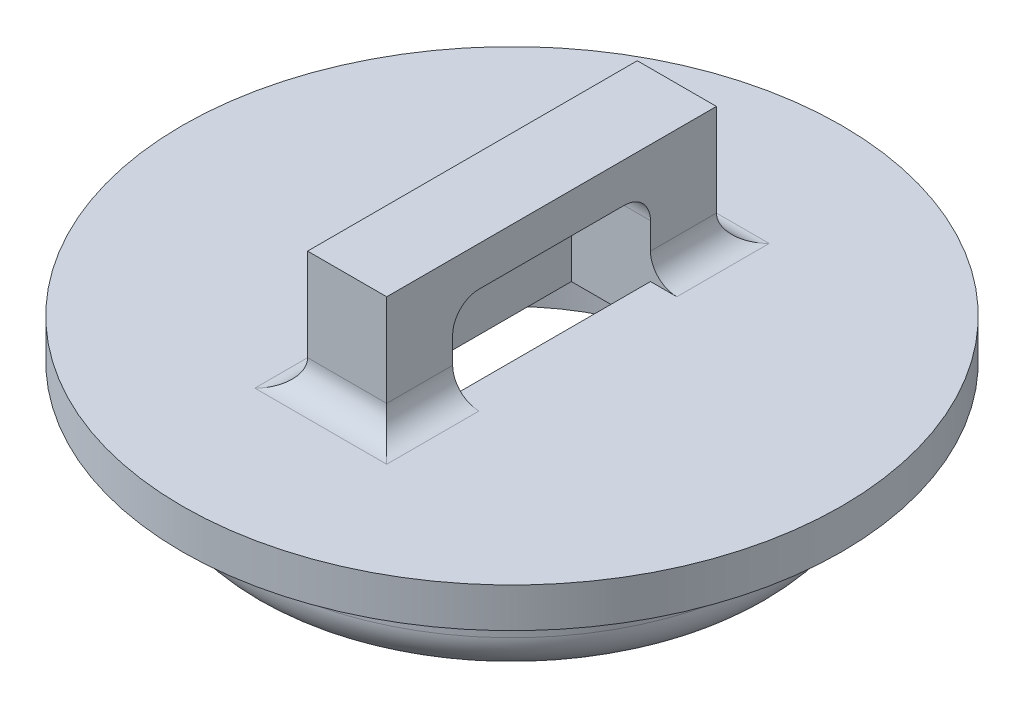
ISO-10303-21;
HEADER;
FILE_DESCRIPTION(('STEP AP214'),'2;1');
FILE_NAME('part.step','',(''),(''),'','','');
FILE_SCHEMA(('AUTOMOTIVE_DESIGN { 1 0 10303 214 1 1 1 1 }'));
ENDSEC;
DATA;
#1=APPLICATION_CONTEXT('core data for automotive mechanical design processes');
#2=APPLICATION_PROTOCOL_DEFINITION('international standard','automotive_design',2000,#1);
#3=PRODUCT_CONTEXT('',#1,'mechanical');
#4=PRODUCT('Part','Part','',(#3));
#5=PRODUCT_RELATED_PRODUCT_CATEGORY('part','',(#4));
#6=PRODUCT_DEFINITION_FORMATION('','',#4);
#7=PRODUCT_DEFINITION_CONTEXT('part definition',#1,'design');
#8=PRODUCT_DEFINITION('design','',#6,#7);
#9=PRODUCT_DEFINITION_SHAPE('','',#8);
#10=(LENGTH_UNIT() NAMED_UNIT(*) SI_UNIT(.MILLI.,.METRE.));
#11=(NAMED_UNIT(*) PLANE_ANGLE_UNIT() SI_UNIT($,.RADIAN.));
#12=(NAMED_UNIT(*) SI_UNIT($,.STERADIAN.) SOLID_ANGLE_UNIT());
#13=UNCERTAINTY_MEASURE_WITH_UNIT(LENGTH_MEASURE(1.E-05),#10,'distance_accuracy_value','');
#14=(GEOMETRIC_REPRESENTATION_CONTEXT(3) GLOBAL_UNCERTAINTY_ASSIGNED_CONTEXT((#13)) GLOBAL_UNIT_ASSIGNED_CONTEXT((#10,
#11,#12)) REPRESENTATION_CONTEXT('',''));
#15=CARTESIAN_POINT('',(0.,0.,0.));
#16=DIRECTION('',(0.,0.,1.));
#17=DIRECTION('',(1.,0.,0.));
#18=AXIS2_PLACEMENT_3D('',#15,#16,#17);
#19=CARTESIAN_POINT('',(0.,5.,0.));
#20=DIRECTION('',(0.,-1.,0.));
#21=DIRECTION('',(0.,0.,-1.));
#22=AXIS2_PLACEMENT_3D('',#19,#20,#21);
#23=PLANE('',#22);
#24=CARTESIAN_POINT('',(0.,5.,0.));
#25=DIRECTION('',(0.,1.,0.));
#26=DIRECTION('',(0.,0.,1.));
#27=AXIS2_PLACEMENT_3D('',#24,#25,#26);
#28=CIRCLE('',#27,25.);
#29=CARTESIAN_POINT('',(0.,5.,25.));
#30=VERTEX_POINT('',#29);
#31=EDGE_CURVE('E244',#30,#30,#28,.T.);
#32=ORIENTED_EDGE('',*,*,#31,.T.);
#33=EDGE_LOOP('',(#32));
#34=FACE_BOUND('',#33,.T.);
#35=DIRECTION('',(0.,0.,1.));
#36=VECTOR('',#35,1.);
#37=CARTESIAN_POINT('',(5.,5.,0.));
#38=LINE('',#37,#36);
#39=CARTESIAN_POINT('',(5.,5.,7.5));
#40=VERTEX_POINT('',#39);
#41=CARTESIAN_POINT('',(5.,5.,14.5));
#42=VERTEX_POINT('',#41);
#43=EDGE_CURVE('E304',#40,#42,#38,.T.);
#44=ORIENTED_EDGE('',*,*,#43,.T.);
#45=DIRECTION('',(1.,0.,0.));
#46=VECTOR('',#45,1.);
#47=CARTESIAN_POINT('',(-3.,5.,14.5));
#48=LINE('',#47,#46);
#49=CARTESIAN_POINT('',(-5.,5.,14.5));
#50=VERTEX_POINT('',#49);
#51=EDGE_CURVE('E274',#42,#50,#48,.F.);
#52=ORIENTED_EDGE('',*,*,#51,.T.);
#53=DIRECTION('',(0.,0.,1.));
#54=VECTOR('',#53,1.);
#55=CARTESIAN_POINT('',(-5.,5.,7.5));
#56=LINE('',#55,#54);
#57=CARTESIAN_POINT('',(-5.,5.,7.5));
#58=VERTEX_POINT('',#57);
#59=EDGE_CURVE('E172',#50,#58,#56,.F.);
#60=ORIENTED_EDGE('',*,*,#59,.T.);
#61=DIRECTION('',(1.,0.,0.));
#62=VECTOR('',#61,1.);
#63=CARTESIAN_POINT('',(0.,5.,7.5));
#64=LINE('',#63,#62);
#65=CARTESIAN_POINT('',(-3.,5.,7.5));
#66=VERTEX_POINT('',#65);
#67=EDGE_CURVE('E165',#58,#66,#64,.T.);
#68=ORIENTED_EDGE('',*,*,#67,.T.);
#69=DIRECTION('',(0.,0.,1.));
#70=VECTOR('',#69,1.);
#71=CARTESIAN_POINT('',(-3.,5.,-7.5));
#72=LINE('',#71,#70);
#73=CARTESIAN_POINT('',(-3.,5.,-7.5));
#74=VERTEX_POINT('',#73);
#75=EDGE_CURVE('E169',#74,#66,#72,.T.);
#76=ORIENTED_EDGE('',*,*,#75,.F.);
#77=DIRECTION('',(-1.,0.,0.));
#78=VECTOR('',#77,1.);
#79=CARTESIAN_POINT('',(0.,5.,-7.5));
#80=LINE('',#79,#78);
#81=CARTESIAN_POINT('',(-5.,5.,-7.5));
#82=VERTEX_POINT('',#81);
#83=EDGE_CURVE('E56',#74,#82,#80,.T.);
#84=ORIENTED_EDGE('',*,*,#83,.T.);
#85=DIRECTION('',(0.,0.,1.));
#86=VECTOR('',#85,1.);
#87=CARTESIAN_POINT('',(-5.,5.,-14.5));
#88=LINE('',#87,#86);
#89=CARTESIAN_POINT('',(-5.,5.,-14.5));
#90=VERTEX_POINT('',#89);
#91=EDGE_CURVE('E294',#82,#90,#88,.F.);
#92=ORIENTED_EDGE('',*,*,#91,.T.);
#93=DIRECTION('',(1.,0.,0.));
#94=VECTOR('',#93,1.);
#95=CARTESIAN_POINT('',(0.,5.,-14.5));
#96=LINE('',#95,#94);
#97=CARTESIAN_POINT('',(5.,5.,-14.5));
#98=VERTEX_POINT('',#97);
#99=EDGE_CURVE('E276',#90,#98,#96,.T.);
#100=ORIENTED_EDGE('',*,*,#99,.T.);
#101=DIRECTION('',(0.,0.,1.));
#102=VECTOR('',#101,1.);
#103=CARTESIAN_POINT('',(5.,5.,0.));
#104=LINE('',#103,#102);
#105=CARTESIAN_POINT('',(5.,5.,-7.5));
#106=VERTEX_POINT('',#105);
#107=EDGE_CURVE('E298',#98,#106,#104,.T.);
#108=ORIENTED_EDGE('',*,*,#107,.T.);
#109=DIRECTION('',(-1.,0.,0.));
#110=VECTOR('',#109,1.);
#111=CARTESIAN_POINT('',(0.,5.,-7.5));
#112=LINE('',#111,#110);
#113=CARTESIAN_POINT('',(3.,5.,-7.5));
#114=VERTEX_POINT('',#113);
#115=EDGE_CURVE('E301',#106,#114,#112,.T.);
#116=ORIENTED_EDGE('',*,*,#115,.T.);
#117=DIRECTION('',(0.,0.,-1.));
#118=VECTOR('',#117,1.);
#119=CARTESIAN_POINT('',(3.,5.,-7.5));
#120=LINE('',#119,#118);
#121=CARTESIAN_POINT('',(3.,5.,7.5));
#122=VERTEX_POINT('',#121);
#123=EDGE_CURVE('E185',#122,#114,#120,.T.);
#124=ORIENTED_EDGE('',*,*,#123,.F.);
#125=DIRECTION('',(1.,0.,0.));
#126=VECTOR('',#125,1.);
#127=CARTESIAN_POINT('',(0.,5.,7.5));
#128=LINE('',#127,#126);
#129=EDGE_CURVE('E64',#122,#40,#128,.T.);
#130=ORIENTED_EDGE('',*,*,#129,.T.);
#131=EDGE_LOOP('',(#44,#52,#60,#68,#76,#84,#92,#100,#108,#116,#124,#130));
#132=FACE_BOUND('',#131,.T.);
#133=ADVANCED_FACE('F41',(#34,#132),#23,.F.);
#134=CARTESIAN_POINT('',(0.,2.,0.));
#135=DIRECTION('',(0.,1.,0.));
#136=DIRECTION('',(0.,0.,1.));
#137=AXIS2_PLACEMENT_3D('',#134,#135,#136);
#138=PLANE('',#137);
#139=CARTESIAN_POINT('',(0.,2.,0.));
#140=DIRECTION('',(0.,1.,0.));
#141=DIRECTION('',(0.,0.,1.));
#142=AXIS2_PLACEMENT_3D('',#139,#140,#141);
#143=CIRCLE('',#142,25.);
#144=CARTESIAN_POINT('',(0.,2.,25.));
#145=VERTEX_POINT('',#144);
#146=EDGE_CURVE('E241',#145,#145,#143,.T.);
#147=ORIENTED_EDGE('',*,*,#146,.F.);
#148=EDGE_LOOP('',(#147));
#149=FACE_BOUND('',#148,.T.);
#150=CARTESIAN_POINT('',(0.,2.,0.));
#151=DIRECTION('',(0.,1.,0.));
#152=DIRECTION('',(0.,0.,1.));
#153=AXIS2_PLACEMENT_3D('',#150,#151,#152);
#154=CIRCLE('',#153,20.);
#155=CARTESIAN_POINT('',(0.,2.,20.));
#156=VERTEX_POINT('',#155);
#157=EDGE_CURVE('E262',#156,#156,#154,.T.);
#158=ORIENTED_EDGE('',*,*,#157,.T.);
#159=EDGE_LOOP('',(#158));
#160=FACE_BOUND('',#159,.T.);
#161=ADVANCED_FACE('F408',(#149,#160),#138,.F.);
#162=CARTESIAN_POINT('',(0.,5.,0.));
#163=DIRECTION('',(0.,1.,0.));
#164=DIRECTION('',(0.,0.,1.));
#165=AXIS2_PLACEMENT_3D('',#162,#163,#164);
#166=CYLINDRICAL_SURFACE('',#165,20.);
#167=CARTESIAN_POINT('',(0.,-1.99999999999998,0.));
#168=DIRECTION('',(0.,1.,0.));
#169=DIRECTION('',(0.,0.,1.));
#170=AXIS2_PLACEMENT_3D('',#167,#168,#169);
#171=CIRCLE('',#170,20.);
#172=CARTESIAN_POINT('',(0.,-1.99999999999998,20.));
#173=VERTEX_POINT('',#172);
#174=EDGE_CURVE('E259',#173,#173,#171,.T.);
#175=ORIENTED_EDGE('',*,*,#174,.T.);
#176=EDGE_LOOP('',(#175));
#177=FACE_BOUND('',#176,.T.);
#178=ORIENTED_EDGE('',*,*,#157,.F.);
#179=EDGE_LOOP('',(#178));
#180=FACE_BOUND('',#179,.T.);
#181=ADVANCED_FACE('F416',(#177,#180),#166,.T.);
#182=CARTESIAN_POINT('',(0.,-2.,0.));
#183=DIRECTION('',(0.,1.,0.));
#184=DIRECTION('',(0.,0.,1.));
#185=AXIS2_PLACEMENT_3D('',#182,#183,#184);
#186=TOROIDAL_SURFACE('',#185,17.,3.);
#187=CARTESIAN_POINT('',(0.,-5.,0.));
#188=DIRECTION('',(0.,1.,0.));
#189=DIRECTION('',(0.,0.,1.));
#190=AXIS2_PLACEMENT_3D('',#187,#188,#189);
#191=CIRCLE('',#190,17.);
#192=CARTESIAN_POINT('',(0.,-5.,17.));
#193=VERTEX_POINT('',#192);
#194=EDGE_CURVE('E256',#193,#193,#191,.T.);
#195=ORIENTED_EDGE('',*,*,#194,.T.);
#196=EDGE_LOOP('',(#195));
#197=FACE_BOUND('',#196,.T.);
#198=ORIENTED_EDGE('',*,*,#174,.F.);
#199=EDGE_LOOP('',(#198));
#200=FACE_BOUND('',#199,.T.);
#201=ADVANCED_FACE('F436',(#197,#200),#186,.T.);
#202=CARTESIAN_POINT('',(0.,-5.,0.));
#203=DIRECTION('',(0.,-1.,0.));
#204=DIRECTION('',(0.,0.,-1.));
#205=AXIS2_PLACEMENT_3D('',#202,#203,#204);
#206=PLANE('',#205);
#207=CARTESIAN_POINT('',(0.,-5.,0.));
#208=DIRECTION('',(0.,1.,0.));
#209=DIRECTION('',(0.,0.,1.));
#210=AXIS2_PLACEMENT_3D('',#207,#208,#209);
#211=CIRCLE('',#210,15.);
#212=CARTESIAN_POINT('',(0.,-5.,15.));
#213=VERTEX_POINT('',#212);
#214=EDGE_CURVE('E253',#213,#213,#211,.T.);
#215=ORIENTED_EDGE('',*,*,#214,.T.);
#216=EDGE_LOOP('',(#215));
#217=FACE_BOUND('',#216,.T.);
#218=ORIENTED_EDGE('',*,*,#194,.F.);
#219=EDGE_LOOP('',(#218));
#220=FACE_BOUND('',#219,.T.);
#221=ADVANCED_FACE('F432',(#217,#220),#206,.T.);
#222=CARTESIAN_POINT('',(0.,5.,0.));
#223=DIRECTION('',(0.,1.,0.));
#224=DIRECTION('',(0.,0.,1.));
#225=AXIS2_PLACEMENT_3D('',#222,#223,#224);
#226=CYLINDRICAL_SURFACE('',#225,15.);
#227=ORIENTED_EDGE('',*,*,#214,.F.);
#228=EDGE_LOOP('',(#227));
#229=FACE_BOUND('',#228,.T.);
#230=CARTESIAN_POINT('',(0.,-1.00000000000002,0.));
#231=DIRECTION('',(0.,1.,0.));
#232=DIRECTION('',(0.,0.,1.));
#233=AXIS2_PLACEMENT_3D('',#230,#231,#232);
#234=CIRCLE('',#233,15.);
#235=CARTESIAN_POINT('',(0.,-1.00000000000002,15.));
#236=VERTEX_POINT('',#235);
#237=EDGE_CURVE('E250',#236,#236,#234,.T.);
#238=ORIENTED_EDGE('',*,*,#237,.T.);
#239=EDGE_LOOP('',(#238));
#240=FACE_BOUND('',#239,.T.);
#241=ADVANCED_FACE('F428',(#229,#240),#226,.F.);
#242=CARTESIAN_POINT('',(0.,-1.,0.));
#243=DIRECTION('',(0.,1.,0.));
#244=DIRECTION('',(0.,0.,1.));
#245=AXIS2_PLACEMENT_3D('',#242,#243,#244);
#246=TOROIDAL_SURFACE('',#245,12.,3.);
#247=CARTESIAN_POINT('',(0.,2.,0.));
#248=DIRECTION('',(0.,1.,0.));
#249=DIRECTION('',(0.,0.,1.));
#250=AXIS2_PLACEMENT_3D('',#247,#248,#249);
#251=CIRCLE('',#250,12.);
#252=CARTESIAN_POINT('',(0.,2.,12.));
#253=VERTEX_POINT('',#252);
#254=EDGE_CURVE('E247',#253,#253,#251,.T.);
#255=ORIENTED_EDGE('',*,*,#254,.T.);
#256=EDGE_LOOP('',(#255));
#257=FACE_BOUND('',#256,.T.);
#258=ORIENTED_EDGE('',*,*,#237,.F.);
#259=EDGE_LOOP('',(#258));
#260=FACE_BOUND('',#259,.T.);
#261=ADVANCED_FACE('F425',(#257,#260),#246,.F.);
#262=CARTESIAN_POINT('',(0.,2.,0.));
#263=DIRECTION('',(0.,1.,0.));
#264=DIRECTION('',(0.,0.,1.));
#265=AXIS2_PLACEMENT_3D('',#262,#263,#264);
#266=PLANE('',#265);
#267=DIRECTION('',(-1.,0.,0.));
#268=VECTOR('',#267,1.);
#269=CARTESIAN_POINT('',(0.,2.,-7.5));
#270=LINE('',#269,#268);
#271=CARTESIAN_POINT('',(3.,2.,-7.5));
#272=VERTEX_POINT('',#271);
#273=CARTESIAN_POINT('',(-3.,2.,-7.5));
#274=VERTEX_POINT('',#273);
#275=EDGE_CURVE('E269',#272,#274,#270,.T.);
#276=ORIENTED_EDGE('',*,*,#275,.T.);
#277=DIRECTION('',(0.,0.,1.));
#278=VECTOR('',#277,1.);
#279=CARTESIAN_POINT('',(-3.,2.,0.));
#280=LINE('',#279,#278);
#281=CARTESIAN_POINT('',(-3.,2.,7.5));
#282=VERTEX_POINT('',#281);
#283=EDGE_CURVE('E272',#274,#282,#280,.T.);
#284=ORIENTED_EDGE('',*,*,#283,.T.);
#285=DIRECTION('',(1.,0.,0.));
#286=VECTOR('',#285,1.);
#287=CARTESIAN_POINT('',(0.,2.,7.5));
#288=LINE('',#287,#286);
#289=CARTESIAN_POINT('',(3.,2.,7.5));
#290=VERTEX_POINT('',#289);
#291=EDGE_CURVE('E181',#282,#290,#288,.T.);
#292=ORIENTED_EDGE('',*,*,#291,.T.);
#293=DIRECTION('',(0.,0.,-1.));
#294=VECTOR('',#293,1.);
#295=CARTESIAN_POINT('',(3.,2.,0.));
#296=LINE('',#295,#294);
#297=EDGE_CURVE('E266',#290,#272,#296,.T.);
#298=ORIENTED_EDGE('',*,*,#297,.T.);
#299=EDGE_LOOP('',(#276,#284,#292,#298));
#300=FACE_BOUND('',#299,.T.);
#301=ORIENTED_EDGE('',*,*,#254,.F.);
#302=EDGE_LOOP('',(#301));
#303=FACE_BOUND('',#302,.T.);
#304=ADVANCED_FACE('F367',(#300,#303),#266,.F.);
#305=CARTESIAN_POINT('',(0.,5.,0.));
#306=DIRECTION('',(0.,1.,0.));
#307=DIRECTION('',(0.,0.,1.));
#308=AXIS2_PLACEMENT_3D('',#305,#306,#307);
#309=CYLINDRICAL_SURFACE('',#308,25.);
#310=ORIENTED_EDGE('',*,*,#146,.T.);
#311=EDGE_LOOP('',(#310));
#312=FACE_BOUND('',#311,.T.);
#313=ORIENTED_EDGE('',*,*,#31,.F.);
#314=EDGE_LOOP('',(#313));
#315=FACE_BOUND('',#314,.T.);
#316=ADVANCED_FACE('F421',(#312,#315),#309,.T.);
#317=CARTESIAN_POINT('',(0.,11.,7.5));
#318=DIRECTION('',(0.,0.,-1.));
#319=DIRECTION('',(-1.,0.,0.));
#320=AXIS2_PLACEMENT_3D('',#317,#318,#319);
#321=PLANE('',#320);
#322=DIRECTION('',(0.,-1.,0.));
#323=VECTOR('',#322,1.);
#324=CARTESIAN_POINT('',(-3.,11.,7.5));
#325=LINE('',#324,#323);
#326=CARTESIAN_POINT('',(-3.,9.,7.5));
#327=VERTEX_POINT('',#326);
#328=CARTESIAN_POINT('',(-3.,7.,7.5));
#329=VERTEX_POINT('',#328);
#330=EDGE_CURVE('E238',#327,#329,#325,.T.);
#331=ORIENTED_EDGE('',*,*,#330,.F.);
#332=DIRECTION('',(1.,0.,0.));
#333=VECTOR('',#332,1.);
#334=CARTESIAN_POINT('',(0.,9.,7.5));
#335=LINE('',#334,#333);
#336=CARTESIAN_POINT('',(3.,9.,7.5));
#337=VERTEX_POINT('',#336);
#338=EDGE_CURVE('E284',#327,#337,#335,.T.);
#339=ORIENTED_EDGE('',*,*,#338,.T.);
#340=DIRECTION('',(0.,-1.,0.));
#341=VECTOR('',#340,1.);
#342=CARTESIAN_POINT('',(3.,11.,7.5));
#343=LINE('',#342,#341);
#344=CARTESIAN_POINT('',(3.,7.,7.5));
#345=VERTEX_POINT('',#344);
#346=EDGE_CURVE('E229',#337,#345,#343,.T.);
#347=ORIENTED_EDGE('',*,*,#346,.T.);
#348=CARTESIAN_POINT('',(5.,7.,7.5));
#349=DIRECTION('',(0.,0.,-1.));
#350=DIRECTION('',(-1.,0.,0.));
#351=AXIS2_PLACEMENT_3D('',#348,#349,#350);
#352=CIRCLE('',#351,2.);
#353=EDGE_CURVE('E326',#345,#40,#352,.F.);
#354=ORIENTED_EDGE('',*,*,#353,.T.);
#355=ORIENTED_EDGE('',*,*,#129,.F.);
#356=DIRECTION('',(0.,1.,0.));
#357=VECTOR('',#356,1.);
#358=CARTESIAN_POINT('',(3.,-5.,7.5));
#359=LINE('',#358,#357);
#360=EDGE_CURVE('E184',#290,#122,#359,.T.);
#361=ORIENTED_EDGE('',*,*,#360,.F.);
#362=ORIENTED_EDGE('',*,*,#291,.F.);
#363=DIRECTION('',(0.,1.,0.));
#364=VECTOR('',#363,1.);
#365=CARTESIAN_POINT('',(-3.,-5.,7.5));
#366=LINE('',#365,#364);
#367=EDGE_CURVE('E177',#282,#66,#366,.T.);
#368=ORIENTED_EDGE('',*,*,#367,.T.);
#369=ORIENTED_EDGE('',*,*,#67,.F.);
#370=CARTESIAN_POINT('',(-5.,7.,7.5));
#371=DIRECTION('',(0.,0.,-1.));
#372=DIRECTION('',(-1.,0.,0.));
#373=AXIS2_PLACEMENT_3D('',#370,#371,#372);
#374=CIRCLE('',#373,2.);
#375=EDGE_CURVE('E11',#58,#329,#374,.F.);
#376=ORIENTED_EDGE('',*,*,#375,.T.);
#377=EDGE_LOOP('',(#331,#339,#347,#354,#355,#361,#362,#368,#369,#376));
#378=FACE_BOUND('',#377,.T.);
#379=ADVANCED_FACE('F179',(#378),#321,.T.);
#380=CARTESIAN_POINT('',(-3.,11.,0.));
#381=DIRECTION('',(1.,0.,0.));
#382=DIRECTION('',(0.,0.,-1.));
#383=AXIS2_PLACEMENT_3D('',#380,#381,#382);
#384=PLANE('',#383);
#385=DIRECTION('',(0.,-1.,0.));
#386=VECTOR('',#385,1.);
#387=CARTESIAN_POINT('',(-3.,11.,-12.5));
#388=LINE('',#387,#386);
#389=CARTESIAN_POINT('',(-3.,14.,-12.5));
#390=VERTEX_POINT('',#389);
#391=CARTESIAN_POINT('',(-3.,7.,-12.5));
#392=VERTEX_POINT('',#391);
#393=EDGE_CURVE('E213',#390,#392,#388,.T.);
#394=ORIENTED_EDGE('',*,*,#393,.T.);
#395=DIRECTION('',(0.,0.,1.));
#396=VECTOR('',#395,1.);
#397=CARTESIAN_POINT('',(-3.,7.,-7.5));
#398=LINE('',#397,#396);
#399=CARTESIAN_POINT('',(-3.,7.,-7.5));
#400=VERTEX_POINT('',#399);
#401=EDGE_CURVE('E313',#392,#400,#398,.T.);
#402=ORIENTED_EDGE('',*,*,#401,.T.);
#403=DIRECTION('',(0.,-1.,0.));
#404=VECTOR('',#403,1.);
#405=CARTESIAN_POINT('',(-3.,11.,-7.5));
#406=LINE('',#405,#404);
#407=CARTESIAN_POINT('',(-3.,9.,-7.5));
#408=VERTEX_POINT('',#407);
#409=EDGE_CURVE('E226',#408,#400,#406,.T.);
#410=ORIENTED_EDGE('',*,*,#409,.F.);
#411=CARTESIAN_POINT('',(-3.,9.,-5.5));
#412=DIRECTION('',(1.,0.,0.));
#413=DIRECTION('',(0.,0.,-1.));
#414=AXIS2_PLACEMENT_3D('',#411,#412,#413);
#415=CIRCLE('',#414,2.);
#416=CARTESIAN_POINT('',(-3.,11.,-5.5));
#417=VERTEX_POINT('',#416);
#418=EDGE_CURVE('E322',#408,#417,#415,.T.);
#419=ORIENTED_EDGE('',*,*,#418,.T.);
#420=DIRECTION('',(0.,0.,1.));
#421=VECTOR('',#420,1.);
#422=CARTESIAN_POINT('',(-3.,11.,-12.5));
#423=LINE('',#422,#421);
#424=CARTESIAN_POINT('',(-3.,11.,5.5));
#425=VERTEX_POINT('',#424);
#426=EDGE_CURVE('E194',#417,#425,#423,.T.);
#427=ORIENTED_EDGE('',*,*,#426,.T.);
#428=CARTESIAN_POINT('',(-3.,9.,5.5));
#429=DIRECTION('',(1.,0.,0.));
#430=DIRECTION('',(0.,0.,-1.));
#431=AXIS2_PLACEMENT_3D('',#428,#429,#430);
#432=CIRCLE('',#431,2.);
#433=EDGE_CURVE('E318',#425,#327,#432,.T.);
#434=ORIENTED_EDGE('',*,*,#433,.T.);
#435=ORIENTED_EDGE('',*,*,#330,.T.);
#436=DIRECTION('',(0.,0.,1.));
#437=VECTOR('',#436,1.);
#438=CARTESIAN_POINT('',(-3.,7.,14.5));
#439=LINE('',#438,#437);
#440=CARTESIAN_POINT('',(-3.,7.,12.5));
#441=VERTEX_POINT('',#440);
#442=EDGE_CURVE('E310',#329,#441,#439,.T.);
#443=ORIENTED_EDGE('',*,*,#442,.T.);
#444=DIRECTION('',(0.,-1.,0.));
#445=VECTOR('',#444,1.);
#446=CARTESIAN_POINT('',(-3.,11.,12.5));
#447=LINE('',#446,#445);
#448=CARTESIAN_POINT('',(-3.,14.,12.5));
#449=VERTEX_POINT('',#448);
#450=EDGE_CURVE('E235',#449,#441,#447,.T.);
#451=ORIENTED_EDGE('',*,*,#450,.F.);
#452=DIRECTION('',(0.,0.,1.));
#453=VECTOR('',#452,1.);
#454=CARTESIAN_POINT('',(-3.,14.,-12.5));
#455=LINE('',#454,#453);
#456=EDGE_CURVE('E200',#390,#449,#455,.T.);
#457=ORIENTED_EDGE('',*,*,#456,.F.);
#458=EDGE_LOOP('',(#394,#402,#410,#419,#427,#434,#435,#443,#451,#457));
#459=FACE_BOUND('',#458,.T.);
#460=ADVANCED_FACE('F345',(#459),#384,.F.);
#461=CARTESIAN_POINT('',(0.,11.,12.5));
#462=DIRECTION('',(0.,0.,-1.));
#463=DIRECTION('',(-1.,0.,0.));
#464=AXIS2_PLACEMENT_3D('',#461,#462,#463);
#465=PLANE('',#464);
#466=ORIENTED_EDGE('',*,*,#450,.T.);
#467=DIRECTION('',(1.,0.,0.));
#468=VECTOR('',#467,1.);
#469=CARTESIAN_POINT('',(3.,7.,12.5));
#470=LINE('',#469,#468);
#471=CARTESIAN_POINT('',(3.,7.,12.5));
#472=VERTEX_POINT('',#471);
#473=EDGE_CURVE('E281',#441,#472,#470,.T.);
#474=ORIENTED_EDGE('',*,*,#473,.T.);
#475=DIRECTION('',(0.,-1.,0.));
#476=VECTOR('',#475,1.);
#477=CARTESIAN_POINT('',(3.,11.,12.5));
#478=LINE('',#477,#476);
#479=CARTESIAN_POINT('',(3.,14.,12.5));
#480=VERTEX_POINT('',#479);
#481=EDGE_CURVE('E232',#480,#472,#478,.T.);
#482=ORIENTED_EDGE('',*,*,#481,.F.);
#483=DIRECTION('',(1.,0.,0.));
#484=VECTOR('',#483,1.);
#485=CARTESIAN_POINT('',(-3.,14.,12.5));
#486=LINE('',#485,#484);
#487=EDGE_CURVE('E203',#449,#480,#486,.T.);
#488=ORIENTED_EDGE('',*,*,#487,.F.);
#489=EDGE_LOOP('',(#466,#474,#482,#488));
#490=FACE_BOUND('',#489,.T.);
#491=ADVANCED_FACE('F540',(#490),#465,.F.);
#492=CARTESIAN_POINT('',(3.,11.,0.));
#493=DIRECTION('',(1.,0.,0.));
#494=DIRECTION('',(0.,0.,-1.));
#495=AXIS2_PLACEMENT_3D('',#492,#493,#494);
#496=PLANE('',#495);
#497=ORIENTED_EDGE('',*,*,#481,.T.);
#498=DIRECTION('',(0.,0.,1.));
#499=VECTOR('',#498,1.);
#500=CARTESIAN_POINT('',(3.,7.,0.));
#501=LINE('',#500,#499);
#502=EDGE_CURVE('E308',#472,#345,#501,.F.);
#503=ORIENTED_EDGE('',*,*,#502,.T.);
#504=ORIENTED_EDGE('',*,*,#346,.F.);
#505=CARTESIAN_POINT('',(3.,9.,5.5));
#506=DIRECTION('',(1.,0.,0.));
#507=DIRECTION('',(0.,0.,-1.));
#508=AXIS2_PLACEMENT_3D('',#505,#506,#507);
#509=CIRCLE('',#508,2.);
#510=CARTESIAN_POINT('',(3.,11.,5.5));
#511=VERTEX_POINT('',#510);
#512=EDGE_CURVE('E316',#337,#511,#509,.F.);
#513=ORIENTED_EDGE('',*,*,#512,.T.);
#514=DIRECTION('',(0.,0.,-1.));
#515=VECTOR('',#514,1.);
#516=CARTESIAN_POINT('',(3.,11.,-12.5));
#517=LINE('',#516,#515);
#518=CARTESIAN_POINT('',(3.,11.,-5.5));
#519=VERTEX_POINT('',#518);
#520=EDGE_CURVE('E204',#511,#519,#517,.T.);
#521=ORIENTED_EDGE('',*,*,#520,.T.);
#522=CARTESIAN_POINT('',(3.,9.,-5.5));
#523=DIRECTION('',(1.,0.,0.));
#524=DIRECTION('',(0.,0.,-1.));
#525=AXIS2_PLACEMENT_3D('',#522,#523,#524);
#526=CIRCLE('',#525,2.);
#527=CARTESIAN_POINT('',(3.,9.,-7.5));
#528=VERTEX_POINT('',#527);
#529=EDGE_CURVE('E320',#519,#528,#526,.F.);
#530=ORIENTED_EDGE('',*,*,#529,.T.);
#531=DIRECTION('',(0.,-1.,0.));
#532=VECTOR('',#531,1.);
#533=CARTESIAN_POINT('',(3.,11.,-7.5));
#534=LINE('',#533,#532);
#535=CARTESIAN_POINT('',(3.,7.,-7.5));
#536=VERTEX_POINT('',#535);
#537=EDGE_CURVE('E223',#528,#536,#534,.T.);
#538=ORIENTED_EDGE('',*,*,#537,.T.);
#539=DIRECTION('',(0.,0.,1.));
#540=VECTOR('',#539,1.);
#541=CARTESIAN_POINT('',(3.,7.,0.));
#542=LINE('',#541,#540);
#543=CARTESIAN_POINT('',(3.,7.,-12.5));
#544=VERTEX_POINT('',#543);
#545=EDGE_CURVE('E306',#536,#544,#542,.F.);
#546=ORIENTED_EDGE('',*,*,#545,.T.);
#547=DIRECTION('',(0.,-1.,0.));
#548=VECTOR('',#547,1.);
#549=CARTESIAN_POINT('',(3.,11.,-12.5));
#550=LINE('',#549,#548);
#551=CARTESIAN_POINT('',(3.,14.,-12.5));
#552=VERTEX_POINT('',#551);
#553=EDGE_CURVE('E220',#552,#544,#550,.T.);
#554=ORIENTED_EDGE('',*,*,#553,.F.);
#555=DIRECTION('',(0.,0.,-1.));
#556=VECTOR('',#555,1.);
#557=CARTESIAN_POINT('',(3.,14.,-12.5));
#558=LINE('',#557,#556);
#559=EDGE_CURVE('E207',#480,#552,#558,.T.);
#560=ORIENTED_EDGE('',*,*,#559,.F.);
#561=EDGE_LOOP('',(#497,#503,#504,#513,#521,#530,#538,#546,#554,#560));
#562=FACE_BOUND('',#561,.T.);
#563=ADVANCED_FACE('F354',(#562),#496,.T.);
#564=CARTESIAN_POINT('',(0.,11.,-7.5));
#565=DIRECTION('',(0.,0.,-1.));
#566=DIRECTION('',(-1.,0.,0.));
#567=AXIS2_PLACEMENT_3D('',#564,#565,#566);
#568=PLANE('',#567);
#569=ORIENTED_EDGE('',*,*,#537,.F.);
#570=DIRECTION('',(1.,0.,0.));
#571=VECTOR('',#570,1.);
#572=CARTESIAN_POINT('',(-3.,9.,-7.5));
#573=LINE('',#572,#571);
#574=EDGE_CURVE('E174',#528,#408,#573,.F.);
#575=ORIENTED_EDGE('',*,*,#574,.T.);
#576=ORIENTED_EDGE('',*,*,#409,.T.);
#577=CARTESIAN_POINT('',(-5.,7.,-7.5));
#578=DIRECTION('',(0.,0.,-1.));
#579=DIRECTION('',(-1.,0.,0.));
#580=AXIS2_PLACEMENT_3D('',#577,#578,#579);
#581=CIRCLE('',#580,2.);
#582=EDGE_CURVE('E333',#400,#82,#581,.T.);
#583=ORIENTED_EDGE('',*,*,#582,.T.);
#584=ORIENTED_EDGE('',*,*,#83,.F.);
#585=DIRECTION('',(0.,1.,0.));
#586=VECTOR('',#585,1.);
#587=CARTESIAN_POINT('',(-3.,-5.,-7.5));
#588=LINE('',#587,#586);
#589=EDGE_CURVE('E188',#274,#74,#588,.T.);
#590=ORIENTED_EDGE('',*,*,#589,.F.);
#591=ORIENTED_EDGE('',*,*,#275,.F.);
#592=DIRECTION('',(0.,1.,0.));
#593=VECTOR('',#592,1.);
#594=CARTESIAN_POINT('',(3.,-5.,-7.5));
#595=LINE('',#594,#593);
#596=EDGE_CURVE('E195',#272,#114,#595,.T.);
#597=ORIENTED_EDGE('',*,*,#596,.T.);
#598=ORIENTED_EDGE('',*,*,#115,.F.);
#599=CARTESIAN_POINT('',(5.,7.,-7.5));
#600=DIRECTION('',(0.,0.,-1.));
#601=DIRECTION('',(-1.,0.,0.));
#602=AXIS2_PLACEMENT_3D('',#599,#600,#601);
#603=CIRCLE('',#602,2.);
#604=EDGE_CURVE('E328',#106,#536,#603,.T.);
#605=ORIENTED_EDGE('',*,*,#604,.T.);
#606=EDGE_LOOP('',(#569,#575,#576,#583,#584,#590,#591,#597,#598,#605));
#607=FACE_BOUND('',#606,.T.);
#608=ADVANCED_FACE('F370',(#607),#568,.F.);
#609=CARTESIAN_POINT('',(0.,11.,-12.5));
#610=DIRECTION('',(0.,0.,-1.));
#611=DIRECTION('',(-1.,0.,0.));
#612=AXIS2_PLACEMENT_3D('',#609,#610,#611);
#613=PLANE('',#612);
#614=ORIENTED_EDGE('',*,*,#553,.T.);
#615=DIRECTION('',(1.,0.,0.));
#616=VECTOR('',#615,1.);
#617=CARTESIAN_POINT('',(0.,7.,-12.5));
#618=LINE('',#617,#616);
#619=EDGE_CURVE('E278',#544,#392,#618,.F.);
#620=ORIENTED_EDGE('',*,*,#619,.T.);
#621=ORIENTED_EDGE('',*,*,#393,.F.);
#622=DIRECTION('',(-1.,0.,0.));
#623=VECTOR('',#622,1.);
#624=CARTESIAN_POINT('',(-3.,14.,-12.5));
#625=LINE('',#624,#623);
#626=EDGE_CURVE('E210',#552,#390,#625,.T.);
#627=ORIENTED_EDGE('',*,*,#626,.F.);
#628=EDGE_LOOP('',(#614,#620,#621,#627));
#629=FACE_BOUND('',#628,.T.);
#630=ADVANCED_FACE('F379',(#629),#613,.T.);
#631=CARTESIAN_POINT('',(0.,11.,0.));
#632=DIRECTION('',(0.,1.,0.));
#633=DIRECTION('',(0.,0.,1.));
#634=AXIS2_PLACEMENT_3D('',#631,#632,#633);
#635=PLANE('',#634);
#636=ORIENTED_EDGE('',*,*,#520,.F.);
#637=DIRECTION('',(1.,0.,0.));
#638=VECTOR('',#637,1.);
#639=CARTESIAN_POINT('',(0.,11.,5.5));
#640=LINE('',#639,#638);
#641=EDGE_CURVE('E290',#511,#425,#640,.F.);
#642=ORIENTED_EDGE('',*,*,#641,.T.);
#643=ORIENTED_EDGE('',*,*,#426,.F.);
#644=DIRECTION('',(1.,0.,0.));
#645=VECTOR('',#644,1.);
#646=CARTESIAN_POINT('',(3.,11.,-5.5));
#647=LINE('',#646,#645);
#648=EDGE_CURVE('E287',#417,#519,#647,.T.);
#649=ORIENTED_EDGE('',*,*,#648,.T.);
#650=EDGE_LOOP('',(#636,#642,#643,#649));
#651=FACE_BOUND('',#650,.T.);
#652=ADVANCED_FACE('F395',(#651),#635,.F.);
#653=CARTESIAN_POINT('',(0.,14.,0.));
#654=DIRECTION('',(0.,1.,0.));
#655=DIRECTION('',(0.,0.,1.));
#656=AXIS2_PLACEMENT_3D('',#653,#654,#655);
#657=PLANE('',#656);
#658=ORIENTED_EDGE('',*,*,#456,.T.);
#659=ORIENTED_EDGE('',*,*,#487,.T.);
#660=ORIENTED_EDGE('',*,*,#559,.T.);
#661=ORIENTED_EDGE('',*,*,#626,.T.);
#662=EDGE_LOOP('',(#658,#659,#660,#661));
#663=FACE_BOUND('',#662,.T.);
#664=ADVANCED_FACE('F397',(#663),#657,.T.);
#665=CARTESIAN_POINT('',(-3.,-5.,-7.5));
#666=DIRECTION('',(-1.,0.,0.));
#667=DIRECTION('',(0.,0.,1.));
#668=AXIS2_PLACEMENT_3D('',#665,#666,#667);
#669=PLANE('',#668);
#670=ORIENTED_EDGE('',*,*,#589,.T.);
#671=ORIENTED_EDGE('',*,*,#75,.T.);
#672=ORIENTED_EDGE('',*,*,#367,.F.);
#673=ORIENTED_EDGE('',*,*,#283,.F.);
#674=EDGE_LOOP('',(#670,#671,#672,#673));
#675=FACE_BOUND('',#674,.T.);
#676=ADVANCED_FACE('F187',(#675),#669,.F.);
#677=CARTESIAN_POINT('',(3.,-5.,-7.5));
#678=DIRECTION('',(1.,0.,0.));
#679=DIRECTION('',(0.,0.,-1.));
#680=AXIS2_PLACEMENT_3D('',#677,#678,#679);
#681=PLANE('',#680);
#682=ORIENTED_EDGE('',*,*,#360,.T.);
#683=ORIENTED_EDGE('',*,*,#123,.T.);
#684=ORIENTED_EDGE('',*,*,#596,.F.);
#685=ORIENTED_EDGE('',*,*,#297,.F.);
#686=EDGE_LOOP('',(#682,#683,#684,#685));
#687=FACE_BOUND('',#686,.T.);
#688=ADVANCED_FACE('F365',(#687),#681,.F.);
#689=CARTESIAN_POINT('',(0.,7.,-14.5));
#690=DIRECTION('',(1.,0.,0.));
#691=DIRECTION('',(0.,0.,-1.));
#692=AXIS2_PLACEMENT_3D('',#689,#690,#691);
#693=CYLINDRICAL_SURFACE('',#692,2.);
#694=ORIENTED_EDGE('',*,*,#99,.F.);
#695=CARTESIAN_POINT('',(-5.,7.,-14.5));
#696=DIRECTION('',(0.707106781186547,0.,-0.707106781186547));
#697=DIRECTION('',(0.707106781186547,0.,0.707106781186547));
#698=AXIS2_PLACEMENT_3D('',#695,#696,#697);
#699=ELLIPSE('',#698,2.82842712474619,2.);
#700=EDGE_CURVE('E335',#90,#392,#699,.F.);
#701=ORIENTED_EDGE('',*,*,#700,.T.);
#702=ORIENTED_EDGE('',*,*,#619,.F.);
#703=CARTESIAN_POINT('',(5.,7.,-14.5));
#704=DIRECTION('',(0.707106781186548,0.,0.707106781186547));
#705=DIRECTION('',(0.707106781186547,0.,-0.707106781186548));
#706=AXIS2_PLACEMENT_3D('',#703,#704,#705);
#707=ELLIPSE('',#706,2.82842712474619,2.);
#708=EDGE_CURVE('E330',#544,#98,#707,.T.);
#709=ORIENTED_EDGE('',*,*,#708,.T.);
#710=EDGE_LOOP('',(#694,#701,#702,#709));
#711=FACE_BOUND('',#710,.T.);
#712=ADVANCED_FACE('F381',(#711),#693,.F.);
#713=CARTESIAN_POINT('',(0.,7.,14.5));
#714=DIRECTION('',(-1.,0.,0.));
#715=DIRECTION('',(0.,0.,1.));
#716=AXIS2_PLACEMENT_3D('',#713,#714,#715);
#717=CYLINDRICAL_SURFACE('',#716,2.);
#718=ORIENTED_EDGE('',*,*,#473,.F.);
#719=CARTESIAN_POINT('',(-5.,7.,14.5));
#720=DIRECTION('',(-0.707106781186547,0.,-0.707106781186547));
#721=DIRECTION('',(-0.707106781186547,0.,0.707106781186547));
#722=AXIS2_PLACEMENT_3D('',#719,#720,#721);
#723=ELLIPSE('',#722,2.82842712474619,2.);
#724=EDGE_CURVE('E49',#441,#50,#723,.T.);
#725=ORIENTED_EDGE('',*,*,#724,.T.);
#726=ORIENTED_EDGE('',*,*,#51,.F.);
#727=CARTESIAN_POINT('',(5.,7.,14.5));
#728=DIRECTION('',(-0.707106781186547,0.,0.707106781186548));
#729=DIRECTION('',(-0.707106781186548,0.,-0.707106781186547));
#730=AXIS2_PLACEMENT_3D('',#727,#728,#729);
#731=ELLIPSE('',#730,2.82842712474619,2.);
#732=EDGE_CURVE('E324',#42,#472,#731,.F.);
#733=ORIENTED_EDGE('',*,*,#732,.T.);
#734=EDGE_LOOP('',(#718,#725,#726,#733));
#735=FACE_BOUND('',#734,.T.);
#736=ADVANCED_FACE('F339',(#735),#717,.F.);
#737=CARTESIAN_POINT('',(0.,9.,5.5));
#738=DIRECTION('',(1.,0.,0.));
#739=DIRECTION('',(0.,0.,-1.));
#740=AXIS2_PLACEMENT_3D('',#737,#738,#739);
#741=CYLINDRICAL_SURFACE('',#740,2.);
#742=ORIENTED_EDGE('',*,*,#433,.F.);
#743=ORIENTED_EDGE('',*,*,#641,.F.);
#744=ORIENTED_EDGE('',*,*,#512,.F.);
#745=ORIENTED_EDGE('',*,*,#338,.F.);
#746=EDGE_LOOP('',(#742,#743,#744,#745));
#747=FACE_BOUND('',#746,.T.);
#748=ADVANCED_FACE('F350',(#747),#741,.F.);
#749=CARTESIAN_POINT('',(0.,9.,-5.5));
#750=DIRECTION('',(-1.,0.,0.));
#751=DIRECTION('',(0.,0.,1.));
#752=AXIS2_PLACEMENT_3D('',#749,#750,#751);
#753=CYLINDRICAL_SURFACE('',#752,2.);
#754=ORIENTED_EDGE('',*,*,#418,.F.);
#755=ORIENTED_EDGE('',*,*,#574,.F.);
#756=ORIENTED_EDGE('',*,*,#529,.F.);
#757=ORIENTED_EDGE('',*,*,#648,.F.);
#758=EDGE_LOOP('',(#754,#755,#756,#757));
#759=FACE_BOUND('',#758,.T.);
#760=ADVANCED_FACE('F392',(#759),#753,.F.);
#761=CARTESIAN_POINT('',(5.,7.,0.));
#762=DIRECTION('',(0.,0.,1.));
#763=DIRECTION('',(1.,0.,0.));
#764=AXIS2_PLACEMENT_3D('',#761,#762,#763);
#765=CYLINDRICAL_SURFACE('',#764,2.);
#766=ORIENTED_EDGE('',*,*,#353,.F.);
#767=ORIENTED_EDGE('',*,*,#502,.F.);
#768=ORIENTED_EDGE('',*,*,#732,.F.);
#769=ORIENTED_EDGE('',*,*,#43,.F.);
#770=EDGE_LOOP('',(#766,#767,#768,#769));
#771=FACE_BOUND('',#770,.T.);
#772=ADVANCED_FACE('F359',(#771),#765,.F.);
#773=CARTESIAN_POINT('',(5.,7.,0.));
#774=DIRECTION('',(0.,0.,1.));
#775=DIRECTION('',(1.,0.,0.));
#776=AXIS2_PLACEMENT_3D('',#773,#774,#775);
#777=CYLINDRICAL_SURFACE('',#776,2.);
#778=ORIENTED_EDGE('',*,*,#708,.F.);
#779=ORIENTED_EDGE('',*,*,#545,.F.);
#780=ORIENTED_EDGE('',*,*,#604,.F.);
#781=ORIENTED_EDGE('',*,*,#107,.F.);
#782=EDGE_LOOP('',(#778,#779,#780,#781));
#783=FACE_BOUND('',#782,.T.);
#784=ADVANCED_FACE('F374',(#783),#777,.F.);
#785=CARTESIAN_POINT('',(-5.,7.,0.));
#786=DIRECTION('',(0.,0.,-1.));
#787=DIRECTION('',(-1.,0.,0.));
#788=AXIS2_PLACEMENT_3D('',#785,#786,#787);
#789=CYLINDRICAL_SURFACE('',#788,2.);
#790=ORIENTED_EDGE('',*,*,#700,.F.);
#791=ORIENTED_EDGE('',*,*,#91,.F.);
#792=ORIENTED_EDGE('',*,*,#582,.F.);
#793=ORIENTED_EDGE('',*,*,#401,.F.);
#794=EDGE_LOOP('',(#790,#791,#792,#793));
#795=FACE_BOUND('',#794,.T.);
#796=ADVANCED_FACE('F386',(#795),#789,.F.);
#797=CARTESIAN_POINT('',(-5.,7.,0.));
#798=DIRECTION('',(0.,0.,-1.));
#799=DIRECTION('',(-1.,0.,0.));
#800=AXIS2_PLACEMENT_3D('',#797,#798,#799);
#801=CYLINDRICAL_SURFACE('',#800,2.);
#802=ORIENTED_EDGE('',*,*,#375,.F.);
#803=ORIENTED_EDGE('',*,*,#59,.F.);
#804=ORIENTED_EDGE('',*,*,#724,.F.);
#805=ORIENTED_EDGE('',*,*,#442,.F.);
#806=EDGE_LOOP('',(#802,#803,#804,#805));
#807=FACE_BOUND('',#806,.T.);
#808=ADVANCED_FACE('F43',(#807),#801,.F.);
#809=CLOSED_SHELL('',(#133,#161,#181,#201,#221,#241,#261,#304,#316,#379,#460,#491,#563,#608,
#630,#652,#664,#676,#688,#712,#736,#748,#760,#772,#784,#796,#808));
#810=MANIFOLD_SOLID_BREP('B2',#809);
#811=ADVANCED_BREP_SHAPE_REPRESENTATION('',(#18,#810),#14);
#812=SHAPE_DEFINITION_REPRESENTATION(#9,#811);
ENDSEC;
END-ISO-10303-21;
